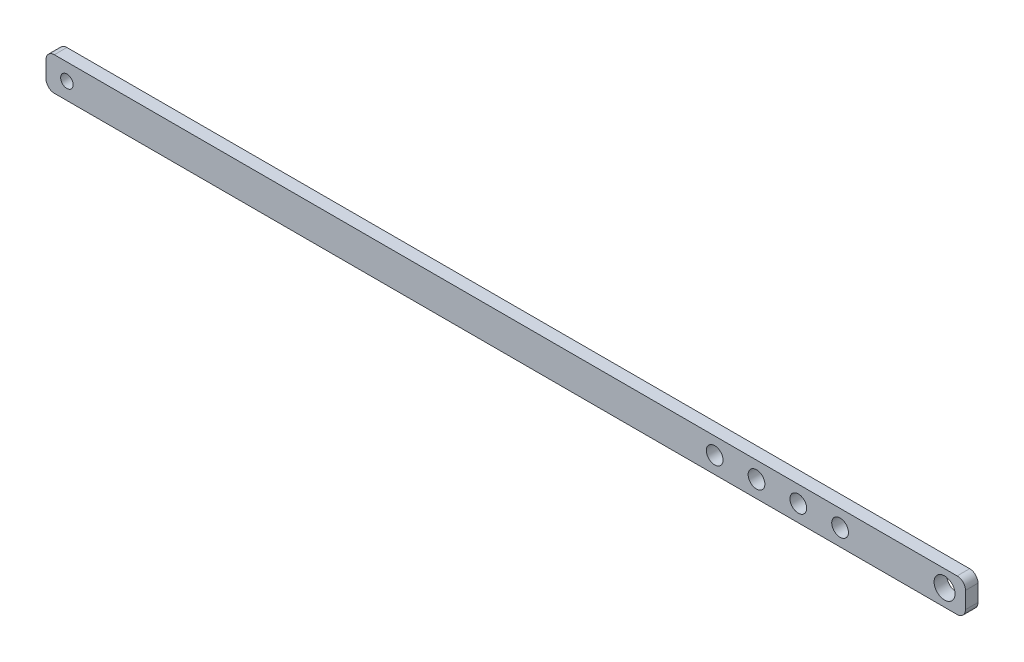
ISO-10303-21;
HEADER;
FILE_DESCRIPTION(('STEP AP214'),'2;1');
FILE_NAME('part.step','',(''),(''),'','','');
FILE_SCHEMA(('AUTOMOTIVE_DESIGN { 1 0 10303 214 1 1 1 1 }'));
ENDSEC;
DATA;
#1=APPLICATION_CONTEXT('core data for automotive mechanical design processes');
#2=APPLICATION_PROTOCOL_DEFINITION('international standard','automotive_design',2000,#1);
#3=PRODUCT_CONTEXT('',#1,'mechanical');
#4=PRODUCT('Part','Part','',(#3));
#5=PRODUCT_RELATED_PRODUCT_CATEGORY('part','',(#4));
#6=PRODUCT_DEFINITION_FORMATION('','',#4);
#7=PRODUCT_DEFINITION_CONTEXT('part definition',#1,'design');
#8=PRODUCT_DEFINITION('design','',#6,#7);
#9=PRODUCT_DEFINITION_SHAPE('','',#8);
#10=(LENGTH_UNIT() NAMED_UNIT(*) SI_UNIT(.MILLI.,.METRE.));
#11=(NAMED_UNIT(*) PLANE_ANGLE_UNIT() SI_UNIT($,.RADIAN.));
#12=(NAMED_UNIT(*) SI_UNIT($,.STERADIAN.) SOLID_ANGLE_UNIT());
#13=UNCERTAINTY_MEASURE_WITH_UNIT(LENGTH_MEASURE(1.E-05),#10,'distance_accuracy_value','');
#14=(GEOMETRIC_REPRESENTATION_CONTEXT(3) GLOBAL_UNCERTAINTY_ASSIGNED_CONTEXT((#13)) GLOBAL_UNIT_ASSIGNED_CONTEXT((#10,
#11,#12)) REPRESENTATION_CONTEXT('',''));
#15=CARTESIAN_POINT('',(0.,0.,0.));
#16=DIRECTION('',(0.,0.,1.));
#17=DIRECTION('',(1.,0.,0.));
#18=AXIS2_PLACEMENT_3D('',#15,#16,#17);
#19=CARTESIAN_POINT('',(110.,-4.,3.));
#20=DIRECTION('',(-1.,0.,0.));
#21=DIRECTION('',(0.,0.,1.));
#22=AXIS2_PLACEMENT_3D('',#19,#20,#21);
#23=PLANE('',#22);
#24=DIRECTION('',(0.,1.,0.));
#25=VECTOR('',#24,1.);
#26=CARTESIAN_POINT('',(110.,-4.,3.));
#27=LINE('',#26,#25);
#28=CARTESIAN_POINT('',(110.,-2.,3.));
#29=VERTEX_POINT('',#28);
#30=CARTESIAN_POINT('',(110.,2.,3.));
#31=VERTEX_POINT('',#30);
#32=EDGE_CURVE('E117',#29,#31,#27,.T.);
#33=ORIENTED_EDGE('',*,*,#32,.F.);
#34=DIRECTION('',(0.,0.,-1.));
#35=VECTOR('',#34,1.);
#36=CARTESIAN_POINT('',(110.,-2.,3.));
#37=LINE('',#36,#35);
#38=CARTESIAN_POINT('',(110.,-2.,0.));
#39=VERTEX_POINT('',#38);
#40=EDGE_CURVE('E102',#29,#39,#37,.T.);
#41=ORIENTED_EDGE('',*,*,#40,.T.);
#42=DIRECTION('',(0.,1.,0.));
#43=VECTOR('',#42,1.);
#44=CARTESIAN_POINT('',(110.,-4.,0.));
#45=LINE('',#44,#43);
#46=CARTESIAN_POINT('',(110.,2.,0.));
#47=VERTEX_POINT('',#46);
#48=EDGE_CURVE('E114',#39,#47,#45,.T.);
#49=ORIENTED_EDGE('',*,*,#48,.T.);
#50=DIRECTION('',(0.,0.,-1.));
#51=VECTOR('',#50,1.);
#52=CARTESIAN_POINT('',(110.,2.,3.));
#53=LINE('',#52,#51);
#54=EDGE_CURVE('E119',#47,#31,#53,.F.);
#55=ORIENTED_EDGE('',*,*,#54,.T.);
#56=EDGE_LOOP('',(#33,#41,#49,#55));
#57=FACE_BOUND('',#56,.T.);
#58=ADVANCED_FACE('F33',(#57),#23,.F.);
#59=CARTESIAN_POINT('',(-110.,4.,3.));
#60=DIRECTION('',(0.,-1.,0.));
#61=DIRECTION('',(0.,0.,-1.));
#62=AXIS2_PLACEMENT_3D('',#59,#60,#61);
#63=PLANE('',#62);
#64=DIRECTION('',(-1.,0.,0.));
#65=VECTOR('',#64,1.);
#66=CARTESIAN_POINT('',(-110.,4.,3.));
#67=LINE('',#66,#65);
#68=CARTESIAN_POINT('',(108.,4.,3.));
#69=VERTEX_POINT('',#68);
#70=CARTESIAN_POINT('',(-108.,4.,3.));
#71=VERTEX_POINT('',#70);
#72=EDGE_CURVE('E172',#69,#71,#67,.T.);
#73=ORIENTED_EDGE('',*,*,#72,.F.);
#74=DIRECTION('',(0.,0.,-1.));
#75=VECTOR('',#74,1.);
#76=CARTESIAN_POINT('',(108.,4.,3.));
#77=LINE('',#76,#75);
#78=CARTESIAN_POINT('',(108.,4.,0.));
#79=VERTEX_POINT('',#78);
#80=EDGE_CURVE('E156',#69,#79,#77,.T.);
#81=ORIENTED_EDGE('',*,*,#80,.T.);
#82=DIRECTION('',(-1.,0.,0.));
#83=VECTOR('',#82,1.);
#84=CARTESIAN_POINT('',(-110.,4.,0.));
#85=LINE('',#84,#83);
#86=CARTESIAN_POINT('',(-108.,4.,0.));
#87=VERTEX_POINT('',#86);
#88=EDGE_CURVE('E123',#79,#87,#85,.T.);
#89=ORIENTED_EDGE('',*,*,#88,.T.);
#90=DIRECTION('',(0.,0.,-1.));
#91=VECTOR('',#90,1.);
#92=CARTESIAN_POINT('',(-108.,4.,3.));
#93=LINE('',#92,#91);
#94=EDGE_CURVE('E154',#87,#71,#93,.F.);
#95=ORIENTED_EDGE('',*,*,#94,.T.);
#96=EDGE_LOOP('',(#73,#81,#89,#95));
#97=FACE_BOUND('',#96,.T.);
#98=ADVANCED_FACE('F244',(#97),#63,.F.);
#99=CARTESIAN_POINT('',(-110.,-4.,3.));
#100=DIRECTION('',(1.,0.,0.));
#101=DIRECTION('',(0.,0.,-1.));
#102=AXIS2_PLACEMENT_3D('',#99,#100,#101);
#103=PLANE('',#102);
#104=DIRECTION('',(0.,-1.,0.));
#105=VECTOR('',#104,1.);
#106=CARTESIAN_POINT('',(-110.,-4.,0.));
#107=LINE('',#106,#105);
#108=CARTESIAN_POINT('',(-110.,2.,0.));
#109=VERTEX_POINT('',#108);
#110=CARTESIAN_POINT('',(-110.,-2.,0.));
#111=VERTEX_POINT('',#110);
#112=EDGE_CURVE('E127',#109,#111,#107,.T.);
#113=ORIENTED_EDGE('',*,*,#112,.T.);
#114=DIRECTION('',(0.,0.,-1.));
#115=VECTOR('',#114,1.);
#116=CARTESIAN_POINT('',(-110.,-2.,3.));
#117=LINE('',#116,#115);
#118=CARTESIAN_POINT('',(-110.,-2.,3.));
#119=VERTEX_POINT('',#118);
#120=EDGE_CURVE('E11',#111,#119,#117,.F.);
#121=ORIENTED_EDGE('',*,*,#120,.T.);
#122=DIRECTION('',(0.,-1.,0.));
#123=VECTOR('',#122,1.);
#124=CARTESIAN_POINT('',(-110.,-4.,3.));
#125=LINE('',#124,#123);
#126=CARTESIAN_POINT('',(-110.,2.,3.));
#127=VERTEX_POINT('',#126);
#128=EDGE_CURVE('E162',#127,#119,#125,.T.);
#129=ORIENTED_EDGE('',*,*,#128,.F.);
#130=DIRECTION('',(0.,0.,-1.));
#131=VECTOR('',#130,1.);
#132=CARTESIAN_POINT('',(-110.,2.,3.));
#133=LINE('',#132,#131);
#134=EDGE_CURVE('E41',#127,#109,#133,.T.);
#135=ORIENTED_EDGE('',*,*,#134,.T.);
#136=EDGE_LOOP('',(#113,#121,#129,#135));
#137=FACE_BOUND('',#136,.T.);
#138=ADVANCED_FACE('F161',(#137),#103,.F.);
#139=CARTESIAN_POINT('',(-110.,-4.,3.));
#140=DIRECTION('',(0.,1.,0.));
#141=DIRECTION('',(0.,0.,1.));
#142=AXIS2_PLACEMENT_3D('',#139,#140,#141);
#143=PLANE('',#142);
#144=DIRECTION('',(1.,0.,0.));
#145=VECTOR('',#144,1.);
#146=CARTESIAN_POINT('',(-110.,-4.,0.));
#147=LINE('',#146,#145);
#148=CARTESIAN_POINT('',(-108.,-4.,0.));
#149=VERTEX_POINT('',#148);
#150=CARTESIAN_POINT('',(108.,-4.,0.));
#151=VERTEX_POINT('',#150);
#152=EDGE_CURVE('E137',#149,#151,#147,.T.);
#153=ORIENTED_EDGE('',*,*,#152,.T.);
#154=DIRECTION('',(0.,0.,-1.));
#155=VECTOR('',#154,1.);
#156=CARTESIAN_POINT('',(108.,-4.,3.));
#157=LINE('',#156,#155);
#158=CARTESIAN_POINT('',(108.,-4.,3.));
#159=VERTEX_POINT('',#158);
#160=EDGE_CURVE('E103',#151,#159,#157,.F.);
#161=ORIENTED_EDGE('',*,*,#160,.T.);
#162=DIRECTION('',(1.,0.,0.));
#163=VECTOR('',#162,1.);
#164=CARTESIAN_POINT('',(-110.,-4.,3.));
#165=LINE('',#164,#163);
#166=CARTESIAN_POINT('',(-108.,-4.,3.));
#167=VERTEX_POINT('',#166);
#168=EDGE_CURVE('E133',#167,#159,#165,.T.);
#169=ORIENTED_EDGE('',*,*,#168,.F.);
#170=DIRECTION('',(0.,0.,-1.));
#171=VECTOR('',#170,1.);
#172=CARTESIAN_POINT('',(-108.,-4.,3.));
#173=LINE('',#172,#171);
#174=EDGE_CURVE('E108',#167,#149,#173,.T.);
#175=ORIENTED_EDGE('',*,*,#174,.T.);
#176=EDGE_LOOP('',(#153,#161,#169,#175));
#177=FACE_BOUND('',#176,.T.);
#178=ADVANCED_FACE('F170',(#177),#143,.F.);
#179=CARTESIAN_POINT('',(0.,0.,3.));
#180=DIRECTION('',(0.,0.,-1.));
#181=DIRECTION('',(-1.,0.,0.));
#182=AXIS2_PLACEMENT_3D('',#179,#180,#181);
#183=PLANE('',#182);
#184=CARTESIAN_POINT('',(60.,0.,3.));
#185=DIRECTION('',(0.,0.,1.));
#186=DIRECTION('',(1.,0.,0.));
#187=AXIS2_PLACEMENT_3D('',#184,#185,#186);
#188=CIRCLE('',#187,2.);
#189=CARTESIAN_POINT('',(62.,0.,3.));
#190=VERTEX_POINT('',#189);
#191=EDGE_CURVE('E200',#190,#190,#188,.T.);
#192=ORIENTED_EDGE('',*,*,#191,.F.);
#193=EDGE_LOOP('',(#192));
#194=FACE_BOUND('',#193,.T.);
#195=CARTESIAN_POINT('',(50.,0.,3.));
#196=DIRECTION('',(0.,0.,1.));
#197=DIRECTION('',(1.,0.,0.));
#198=AXIS2_PLACEMENT_3D('',#195,#196,#197);
#199=CIRCLE('',#198,2.);
#200=CARTESIAN_POINT('',(52.,0.,3.));
#201=VERTEX_POINT('',#200);
#202=EDGE_CURVE('E201',#201,#201,#199,.T.);
#203=ORIENTED_EDGE('',*,*,#202,.F.);
#204=EDGE_LOOP('',(#203));
#205=FACE_BOUND('',#204,.T.);
#206=CARTESIAN_POINT('',(70.,0.,3.));
#207=DIRECTION('',(0.,0.,1.));
#208=DIRECTION('',(1.,0.,0.));
#209=AXIS2_PLACEMENT_3D('',#206,#207,#208);
#210=CIRCLE('',#209,2.);
#211=CARTESIAN_POINT('',(72.,0.,3.));
#212=VERTEX_POINT('',#211);
#213=EDGE_CURVE('E193',#212,#212,#210,.T.);
#214=ORIENTED_EDGE('',*,*,#213,.F.);
#215=EDGE_LOOP('',(#214));
#216=FACE_BOUND('',#215,.T.);
#217=CARTESIAN_POINT('',(80.,0.,3.));
#218=DIRECTION('',(0.,0.,1.));
#219=DIRECTION('',(1.,0.,0.));
#220=AXIS2_PLACEMENT_3D('',#217,#218,#219);
#221=CIRCLE('',#220,2.);
#222=CARTESIAN_POINT('',(82.,0.,3.));
#223=VERTEX_POINT('',#222);
#224=EDGE_CURVE('E187',#223,#223,#221,.T.);
#225=ORIENTED_EDGE('',*,*,#224,.F.);
#226=EDGE_LOOP('',(#225));
#227=FACE_BOUND('',#226,.T.);
#228=CARTESIAN_POINT('',(105.,0.,3.));
#229=DIRECTION('',(0.,0.,1.));
#230=DIRECTION('',(1.,0.,0.));
#231=AXIS2_PLACEMENT_3D('',#228,#229,#230);
#232=CIRCLE('',#231,2.49999999999999);
#233=CARTESIAN_POINT('',(107.5,0.,3.));
#234=VERTEX_POINT('',#233);
#235=EDGE_CURVE('E181',#234,#234,#232,.T.);
#236=ORIENTED_EDGE('',*,*,#235,.F.);
#237=EDGE_LOOP('',(#236));
#238=FACE_BOUND('',#237,.T.);
#239=CARTESIAN_POINT('',(-105.,0.,3.));
#240=DIRECTION('',(0.,0.,1.));
#241=DIRECTION('',(1.,0.,0.));
#242=AXIS2_PLACEMENT_3D('',#239,#240,#241);
#243=CIRCLE('',#242,1.5);
#244=CARTESIAN_POINT('',(-103.5,0.,3.));
#245=VERTEX_POINT('',#244);
#246=EDGE_CURVE('E130',#245,#245,#243,.T.);
#247=ORIENTED_EDGE('',*,*,#246,.F.);
#248=EDGE_LOOP('',(#247));
#249=FACE_BOUND('',#248,.T.);
#250=ORIENTED_EDGE('',*,*,#168,.T.);
#251=CARTESIAN_POINT('',(108.,-2.,3.));
#252=DIRECTION('',(0.,0.,-1.));
#253=DIRECTION('',(-1.,0.,0.));
#254=AXIS2_PLACEMENT_3D('',#251,#252,#253);
#255=CIRCLE('',#254,2.);
#256=EDGE_CURVE('E152',#159,#29,#255,.F.);
#257=ORIENTED_EDGE('',*,*,#256,.T.);
#258=ORIENTED_EDGE('',*,*,#32,.T.);
#259=CARTESIAN_POINT('',(108.,2.,3.));
#260=DIRECTION('',(0.,0.,-1.));
#261=DIRECTION('',(-1.,0.,0.));
#262=AXIS2_PLACEMENT_3D('',#259,#260,#261);
#263=CIRCLE('',#262,2.);
#264=EDGE_CURVE('E150',#31,#69,#263,.F.);
#265=ORIENTED_EDGE('',*,*,#264,.T.);
#266=ORIENTED_EDGE('',*,*,#72,.T.);
#267=CARTESIAN_POINT('',(-108.,2.,3.));
#268=DIRECTION('',(0.,0.,-1.));
#269=DIRECTION('',(-1.,0.,0.));
#270=AXIS2_PLACEMENT_3D('',#267,#268,#269);
#271=CIRCLE('',#270,2.);
#272=EDGE_CURVE('E53',#71,#127,#271,.F.);
#273=ORIENTED_EDGE('',*,*,#272,.T.);
#274=ORIENTED_EDGE('',*,*,#128,.T.);
#275=CARTESIAN_POINT('',(-108.,-2.,3.));
#276=DIRECTION('',(0.,0.,-1.));
#277=DIRECTION('',(-1.,0.,0.));
#278=AXIS2_PLACEMENT_3D('',#275,#276,#277);
#279=CIRCLE('',#278,2.);
#280=EDGE_CURVE('E148',#119,#167,#279,.F.);
#281=ORIENTED_EDGE('',*,*,#280,.T.);
#282=EDGE_LOOP('',(#250,#257,#258,#265,#266,#273,#274,#281));
#283=FACE_BOUND('',#282,.T.);
#284=ADVANCED_FACE('F212',(#194,#205,#216,#227,#238,#249,#283),#183,.F.);
#285=CARTESIAN_POINT('',(0.,0.,0.));
#286=DIRECTION('',(0.,0.,-1.));
#287=DIRECTION('',(-1.,0.,0.));
#288=AXIS2_PLACEMENT_3D('',#285,#286,#287);
#289=PLANE('',#288);
#290=CARTESIAN_POINT('',(60.,0.,0.));
#291=DIRECTION('',(0.,0.,-1.));
#292=DIRECTION('',(-1.,0.,0.));
#293=AXIS2_PLACEMENT_3D('',#290,#291,#292);
#294=CIRCLE('',#293,2.);
#295=CARTESIAN_POINT('',(58.,0.,0.));
#296=VERTEX_POINT('',#295);
#297=EDGE_CURVE('E196',#296,#296,#294,.F.);
#298=ORIENTED_EDGE('',*,*,#297,.T.);
#299=EDGE_LOOP('',(#298));
#300=FACE_BOUND('',#299,.T.);
#301=CARTESIAN_POINT('',(50.,0.,0.));
#302=DIRECTION('',(0.,0.,-1.));
#303=DIRECTION('',(-1.,0.,0.));
#304=AXIS2_PLACEMENT_3D('',#301,#302,#303);
#305=CIRCLE('',#304,2.);
#306=CARTESIAN_POINT('',(48.,0.,0.));
#307=VERTEX_POINT('',#306);
#308=EDGE_CURVE('E197',#307,#307,#305,.F.);
#309=ORIENTED_EDGE('',*,*,#308,.T.);
#310=EDGE_LOOP('',(#309));
#311=FACE_BOUND('',#310,.T.);
#312=CARTESIAN_POINT('',(70.,0.,0.));
#313=DIRECTION('',(0.,0.,-1.));
#314=DIRECTION('',(-1.,0.,0.));
#315=AXIS2_PLACEMENT_3D('',#312,#313,#314);
#316=CIRCLE('',#315,2.);
#317=CARTESIAN_POINT('',(68.,0.,0.));
#318=VERTEX_POINT('',#317);
#319=EDGE_CURVE('E190',#318,#318,#316,.F.);
#320=ORIENTED_EDGE('',*,*,#319,.T.);
#321=EDGE_LOOP('',(#320));
#322=FACE_BOUND('',#321,.T.);
#323=CARTESIAN_POINT('',(80.,0.,0.));
#324=DIRECTION('',(0.,0.,-1.));
#325=DIRECTION('',(-1.,0.,0.));
#326=AXIS2_PLACEMENT_3D('',#323,#324,#325);
#327=CIRCLE('',#326,2.);
#328=CARTESIAN_POINT('',(78.,0.,0.));
#329=VERTEX_POINT('',#328);
#330=EDGE_CURVE('E184',#329,#329,#327,.F.);
#331=ORIENTED_EDGE('',*,*,#330,.T.);
#332=EDGE_LOOP('',(#331));
#333=FACE_BOUND('',#332,.T.);
#334=CARTESIAN_POINT('',(105.,0.,0.));
#335=DIRECTION('',(0.,0.,-1.));
#336=DIRECTION('',(-1.,0.,0.));
#337=AXIS2_PLACEMENT_3D('',#334,#335,#336);
#338=CIRCLE('',#337,2.49999999999999);
#339=CARTESIAN_POINT('',(102.5,0.,0.));
#340=VERTEX_POINT('',#339);
#341=EDGE_CURVE('E178',#340,#340,#338,.F.);
#342=ORIENTED_EDGE('',*,*,#341,.T.);
#343=EDGE_LOOP('',(#342));
#344=FACE_BOUND('',#343,.T.);
#345=CARTESIAN_POINT('',(-105.,0.,0.));
#346=DIRECTION('',(0.,0.,-1.));
#347=DIRECTION('',(-1.,0.,0.));
#348=AXIS2_PLACEMENT_3D('',#345,#346,#347);
#349=CIRCLE('',#348,1.5);
#350=CARTESIAN_POINT('',(-106.5,0.,0.));
#351=VERTEX_POINT('',#350);
#352=EDGE_CURVE('E124',#351,#351,#349,.F.);
#353=ORIENTED_EDGE('',*,*,#352,.T.);
#354=EDGE_LOOP('',(#353));
#355=FACE_BOUND('',#354,.T.);
#356=ORIENTED_EDGE('',*,*,#48,.F.);
#357=CARTESIAN_POINT('',(108.,-2.,0.));
#358=DIRECTION('',(0.,0.,-1.));
#359=DIRECTION('',(-1.,0.,0.));
#360=AXIS2_PLACEMENT_3D('',#357,#358,#359);
#361=CIRCLE('',#360,2.);
#362=EDGE_CURVE('E98',#39,#151,#361,.T.);
#363=ORIENTED_EDGE('',*,*,#362,.T.);
#364=ORIENTED_EDGE('',*,*,#152,.F.);
#365=CARTESIAN_POINT('',(-108.,-2.,0.));
#366=DIRECTION('',(0.,0.,-1.));
#367=DIRECTION('',(-1.,0.,0.));
#368=AXIS2_PLACEMENT_3D('',#365,#366,#367);
#369=CIRCLE('',#368,2.);
#370=EDGE_CURVE('E141',#149,#111,#369,.T.);
#371=ORIENTED_EDGE('',*,*,#370,.T.);
#372=ORIENTED_EDGE('',*,*,#112,.F.);
#373=CARTESIAN_POINT('',(-108.,2.,0.));
#374=DIRECTION('',(0.,0.,-1.));
#375=DIRECTION('',(-1.,0.,0.));
#376=AXIS2_PLACEMENT_3D('',#373,#374,#375);
#377=CIRCLE('',#376,2.);
#378=EDGE_CURVE('E118',#109,#87,#377,.T.);
#379=ORIENTED_EDGE('',*,*,#378,.T.);
#380=ORIENTED_EDGE('',*,*,#88,.F.);
#381=CARTESIAN_POINT('',(108.,2.,0.));
#382=DIRECTION('',(0.,0.,-1.));
#383=DIRECTION('',(-1.,0.,0.));
#384=AXIS2_PLACEMENT_3D('',#381,#382,#383);
#385=CIRCLE('',#384,2.);
#386=EDGE_CURVE('E109',#79,#47,#385,.T.);
#387=ORIENTED_EDGE('',*,*,#386,.T.);
#388=EDGE_LOOP('',(#356,#363,#364,#371,#372,#379,#380,#387));
#389=FACE_BOUND('',#388,.T.);
#390=ADVANCED_FACE('F121',(#300,#311,#322,#333,#344,#355,#389),#289,.T.);
#391=CARTESIAN_POINT('',(108.,-2.,3.));
#392=DIRECTION('',(0.,0.,-1.));
#393=DIRECTION('',(-1.,0.,0.));
#394=AXIS2_PLACEMENT_3D('',#391,#392,#393);
#395=CYLINDRICAL_SURFACE('',#394,2.);
#396=ORIENTED_EDGE('',*,*,#256,.F.);
#397=ORIENTED_EDGE('',*,*,#160,.F.);
#398=ORIENTED_EDGE('',*,*,#362,.F.);
#399=ORIENTED_EDGE('',*,*,#40,.F.);
#400=EDGE_LOOP('',(#396,#397,#398,#399));
#401=FACE_BOUND('',#400,.T.);
#402=ADVANCED_FACE('F101',(#401),#395,.T.);
#403=CARTESIAN_POINT('',(108.,2.,3.));
#404=DIRECTION('',(0.,0.,-1.));
#405=DIRECTION('',(-1.,0.,0.));
#406=AXIS2_PLACEMENT_3D('',#403,#404,#405);
#407=CYLINDRICAL_SURFACE('',#406,2.);
#408=ORIENTED_EDGE('',*,*,#264,.F.);
#409=ORIENTED_EDGE('',*,*,#54,.F.);
#410=ORIENTED_EDGE('',*,*,#386,.F.);
#411=ORIENTED_EDGE('',*,*,#80,.F.);
#412=EDGE_LOOP('',(#408,#409,#410,#411));
#413=FACE_BOUND('',#412,.T.);
#414=ADVANCED_FACE('F239',(#413),#407,.T.);
#415=CARTESIAN_POINT('',(-108.,-2.,3.));
#416=DIRECTION('',(0.,0.,-1.));
#417=DIRECTION('',(-1.,0.,0.));
#418=AXIS2_PLACEMENT_3D('',#415,#416,#417);
#419=CYLINDRICAL_SURFACE('',#418,2.);
#420=ORIENTED_EDGE('',*,*,#280,.F.);
#421=ORIENTED_EDGE('',*,*,#120,.F.);
#422=ORIENTED_EDGE('',*,*,#370,.F.);
#423=ORIENTED_EDGE('',*,*,#174,.F.);
#424=EDGE_LOOP('',(#420,#421,#422,#423));
#425=FACE_BOUND('',#424,.T.);
#426=ADVANCED_FACE('F167',(#425),#419,.T.);
#427=CARTESIAN_POINT('',(-108.,2.,3.));
#428=DIRECTION('',(0.,0.,-1.));
#429=DIRECTION('',(-1.,0.,0.));
#430=AXIS2_PLACEMENT_3D('',#427,#428,#429);
#431=CYLINDRICAL_SURFACE('',#430,2.);
#432=ORIENTED_EDGE('',*,*,#272,.F.);
#433=ORIENTED_EDGE('',*,*,#94,.F.);
#434=ORIENTED_EDGE('',*,*,#378,.F.);
#435=ORIENTED_EDGE('',*,*,#134,.F.);
#436=EDGE_LOOP('',(#432,#433,#434,#435));
#437=FACE_BOUND('',#436,.T.);
#438=ADVANCED_FACE('F35',(#437),#431,.T.);
#439=CARTESIAN_POINT('',(-105.,0.,-4.24264068711928));
#440=DIRECTION('',(0.,0.,1.));
#441=DIRECTION('',(1.,0.,0.));
#442=AXIS2_PLACEMENT_3D('',#439,#440,#441);
#443=CYLINDRICAL_SURFACE('',#442,1.5);
#444=ORIENTED_EDGE('',*,*,#246,.T.);
#445=EDGE_LOOP('',(#444));
#446=FACE_BOUND('',#445,.T.);
#447=ORIENTED_EDGE('',*,*,#352,.F.);
#448=EDGE_LOOP('',(#447));
#449=FACE_BOUND('',#448,.T.);
#450=ADVANCED_FACE('F226',(#446,#449),#443,.F.);
#451=CARTESIAN_POINT('',(105.,0.,-7.07106781186545));
#452=DIRECTION('',(0.,0.,1.));
#453=DIRECTION('',(1.,0.,0.));
#454=AXIS2_PLACEMENT_3D('',#451,#452,#453);
#455=CYLINDRICAL_SURFACE('',#454,2.49999999999999);
#456=ORIENTED_EDGE('',*,*,#235,.T.);
#457=EDGE_LOOP('',(#456));
#458=FACE_BOUND('',#457,.T.);
#459=ORIENTED_EDGE('',*,*,#341,.F.);
#460=EDGE_LOOP('',(#459));
#461=FACE_BOUND('',#460,.T.);
#462=ADVANCED_FACE('F229',(#458,#461),#455,.F.);
#463=CARTESIAN_POINT('',(80.,0.,-5.65685424949238));
#464=DIRECTION('',(0.,0.,1.));
#465=DIRECTION('',(1.,0.,0.));
#466=AXIS2_PLACEMENT_3D('',#463,#464,#465);
#467=CYLINDRICAL_SURFACE('',#466,2.);
#468=ORIENTED_EDGE('',*,*,#224,.T.);
#469=EDGE_LOOP('',(#468));
#470=FACE_BOUND('',#469,.T.);
#471=ORIENTED_EDGE('',*,*,#330,.F.);
#472=EDGE_LOOP('',(#471));
#473=FACE_BOUND('',#472,.T.);
#474=ADVANCED_FACE('F275',(#470,#473),#467,.F.);
#475=CARTESIAN_POINT('',(70.,0.,-5.65685424949238));
#476=DIRECTION('',(0.,0.,1.));
#477=DIRECTION('',(1.,0.,0.));
#478=AXIS2_PLACEMENT_3D('',#475,#476,#477);
#479=CYLINDRICAL_SURFACE('',#478,2.);
#480=ORIENTED_EDGE('',*,*,#213,.T.);
#481=EDGE_LOOP('',(#480));
#482=FACE_BOUND('',#481,.T.);
#483=ORIENTED_EDGE('',*,*,#319,.F.);
#484=EDGE_LOOP('',(#483));
#485=FACE_BOUND('',#484,.T.);
#486=ADVANCED_FACE('F283',(#482,#485),#479,.F.);
#487=CARTESIAN_POINT('',(50.,0.,-5.65685424949237));
#488=DIRECTION('',(0.,0.,1.));
#489=DIRECTION('',(1.,0.,0.));
#490=AXIS2_PLACEMENT_3D('',#487,#488,#489);
#491=CYLINDRICAL_SURFACE('',#490,2.);
#492=ORIENTED_EDGE('',*,*,#202,.T.);
#493=EDGE_LOOP('',(#492));
#494=FACE_BOUND('',#493,.T.);
#495=ORIENTED_EDGE('',*,*,#308,.F.);
#496=EDGE_LOOP('',(#495));
#497=FACE_BOUND('',#496,.T.);
#498=ADVANCED_FACE('F292',(#494,#497),#491,.F.);
#499=CARTESIAN_POINT('',(60.,0.,-5.65685424949237));
#500=DIRECTION('',(0.,0.,1.));
#501=DIRECTION('',(1.,0.,0.));
#502=AXIS2_PLACEMENT_3D('',#499,#500,#501);
#503=CYLINDRICAL_SURFACE('',#502,2.);
#504=ORIENTED_EDGE('',*,*,#191,.T.);
#505=EDGE_LOOP('',(#504));
#506=FACE_BOUND('',#505,.T.);
#507=ORIENTED_EDGE('',*,*,#297,.F.);
#508=EDGE_LOOP('',(#507));
#509=FACE_BOUND('',#508,.T.);
#510=ADVANCED_FACE('F209',(#506,#509),#503,.F.);
#511=CLOSED_SHELL('',(#58,#98,#138,#178,#284,#390,#402,#414,#426,#438,#450,#462,#474,#486,#498,#510));
#512=MANIFOLD_SOLID_BREP('B2',#511);
#513=ADVANCED_BREP_SHAPE_REPRESENTATION('',(#18,#512),#14);
#514=SHAPE_DEFINITION_REPRESENTATION(#9,#513);
ENDSEC;
END-ISO-10303-21;
